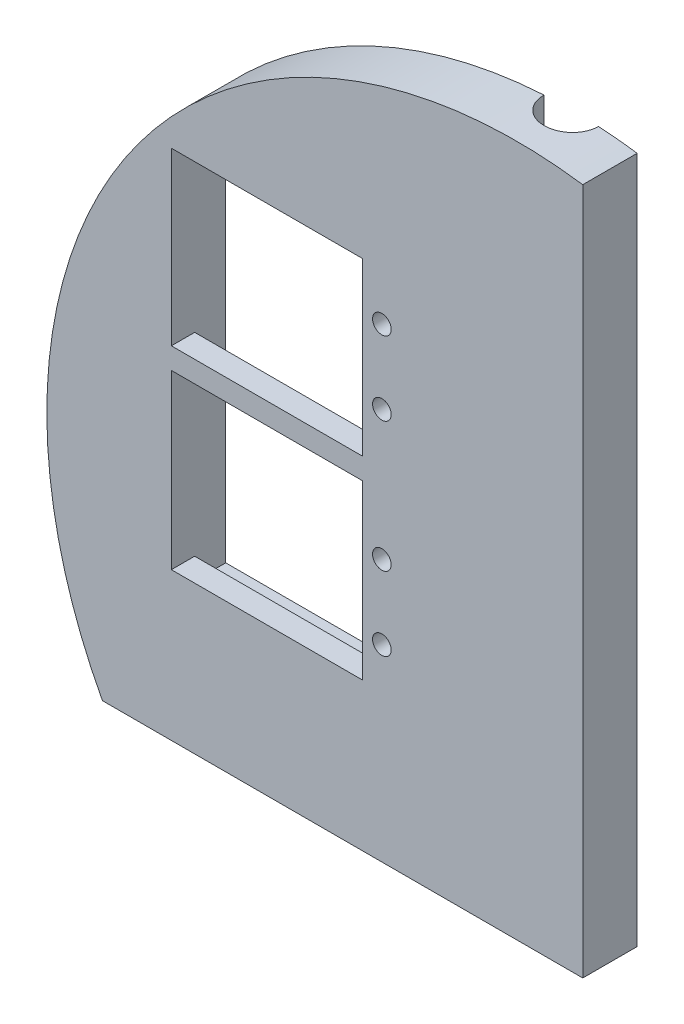
ISO-10303-21;
HEADER;
FILE_DESCRIPTION(('STEP AP214'),'2;1');
FILE_NAME('part.step','',(''),(''),'','','');
FILE_SCHEMA(('AUTOMOTIVE_DESIGN { 1 0 10303 214 1 1 1 1 }'));
ENDSEC;
DATA;
#1=APPLICATION_CONTEXT('core data for automotive mechanical design processes');
#2=APPLICATION_PROTOCOL_DEFINITION('international standard','automotive_design',2000,#1);
#3=PRODUCT_CONTEXT('',#1,'mechanical');
#4=PRODUCT('Part','Part','',(#3));
#5=PRODUCT_RELATED_PRODUCT_CATEGORY('part','',(#4));
#6=PRODUCT_DEFINITION_FORMATION('','',#4);
#7=PRODUCT_DEFINITION_CONTEXT('part definition',#1,'design');
#8=PRODUCT_DEFINITION('design','',#6,#7);
#9=PRODUCT_DEFINITION_SHAPE('','',#8);
#10=(LENGTH_UNIT() NAMED_UNIT(*) SI_UNIT(.MILLI.,.METRE.));
#11=(NAMED_UNIT(*) PLANE_ANGLE_UNIT() SI_UNIT($,.RADIAN.));
#12=(NAMED_UNIT(*) SI_UNIT($,.STERADIAN.) SOLID_ANGLE_UNIT());
#13=UNCERTAINTY_MEASURE_WITH_UNIT(LENGTH_MEASURE(1.E-05),#10,'distance_accuracy_value','');
#14=(GEOMETRIC_REPRESENTATION_CONTEXT(3) GLOBAL_UNCERTAINTY_ASSIGNED_CONTEXT((#13)) GLOBAL_UNIT_ASSIGNED_CONTEXT((#10,
#11,#12)) REPRESENTATION_CONTEXT('',''));
#15=CARTESIAN_POINT('',(0.,0.,0.));
#16=DIRECTION('',(0.,0.,1.));
#17=DIRECTION('',(1.,0.,0.));
#18=AXIS2_PLACEMENT_3D('',#15,#16,#17);
#19=CARTESIAN_POINT('',(0.,0.,0.));
#20=DIRECTION('',(0.,0.,1.));
#21=DIRECTION('',(1.,0.,0.));
#22=AXIS2_PLACEMENT_3D('',#19,#20,#21);
#23=PLANE('',#22);
#24=DIRECTION('',(-1.,0.,0.));
#25=VECTOR('',#24,1.);
#26=CARTESIAN_POINT('',(0.,-16.7383494563795,0.));
#27=LINE('',#26,#25);
#28=CARTESIAN_POINT('',(3.09999999999997,-16.7383494563795,0.));
#29=VERTEX_POINT('',#28);
#30=CARTESIAN_POINT('',(2.50000000000061,-16.7383494563795,0.));
#31=VERTEX_POINT('',#30);
#32=EDGE_CURVE('E333',#29,#31,#27,.T.);
#33=ORIENTED_EDGE('',*,*,#32,.F.);
#34=DIRECTION('',(0.,1.,0.));
#35=VECTOR('',#34,1.);
#36=CARTESIAN_POINT('',(3.09999999999997,-16.7383494563795,0.));
#37=LINE('',#36,#35);
#38=CARTESIAN_POINT('',(3.09999999999997,-14.7383494563795,0.));
#39=VERTEX_POINT('',#38);
#40=EDGE_CURVE('E59',#29,#39,#37,.T.);
#41=ORIENTED_EDGE('',*,*,#40,.T.);
#42=DIRECTION('',(-1.,0.,0.));
#43=VECTOR('',#42,1.);
#44=CARTESIAN_POINT('',(0.,-14.7383494563795,0.));
#45=LINE('',#44,#43);
#46=CARTESIAN_POINT('',(2.50000000000061,-14.7383494563795,0.));
#47=VERTEX_POINT('',#46);
#48=EDGE_CURVE('E329',#39,#47,#45,.T.);
#49=ORIENTED_EDGE('',*,*,#48,.T.);
#50=DIRECTION('',(0.,1.,0.));
#51=VECTOR('',#50,1.);
#52=CARTESIAN_POINT('',(2.50000000000061,-22.5,0.));
#53=LINE('',#52,#51);
#54=CARTESIAN_POINT('',(2.50000000000061,-9.50000000000001,0.));
#55=VERTEX_POINT('',#54);
#56=EDGE_CURVE('E357',#47,#55,#53,.T.);
#57=ORIENTED_EDGE('',*,*,#56,.T.);
#58=DIRECTION('',(-1.,0.,0.));
#59=VECTOR('',#58,1.);
#60=CARTESIAN_POINT('',(0.,-9.50000000000001,0.));
#61=LINE('',#60,#59);
#62=CARTESIAN_POINT('',(3.50000000003442,-9.50000000000001,0.));
#63=VERTEX_POINT('',#62);
#64=EDGE_CURVE('E278',#63,#55,#61,.T.);
#65=ORIENTED_EDGE('',*,*,#64,.F.);
#66=DIRECTION('',(0.,1.,0.));
#67=VECTOR('',#66,1.);
#68=CARTESIAN_POINT('',(3.50000000003442,-9.50000000000001,0.));
#69=LINE('',#68,#67);
#70=CARTESIAN_POINT('',(3.50000000003442,60.398675482164,0.));
#71=VERTEX_POINT('',#70);
#72=EDGE_CURVE('E290',#63,#71,#69,.T.);
#73=ORIENTED_EDGE('',*,*,#72,.T.);
#74=CARTESIAN_POINT('',(0.,0.,0.));
#75=DIRECTION('',(0.,0.,1.));
#76=DIRECTION('',(1.,0.,0.));
#77=AXIS2_PLACEMENT_3D('',#74,#75,#76);
#78=CIRCLE('',#77,60.5);
#79=CARTESIAN_POINT('',(8.48784603441241,59.9016399583193,0.));
#80=VERTEX_POINT('',#79);
#81=EDGE_CURVE('E273',#80,#71,#78,.T.);
#82=ORIENTED_EDGE('',*,*,#81,.F.);
#83=DIRECTION('',(0.,-1.,0.));
#84=VECTOR('',#83,1.);
#85=CARTESIAN_POINT('',(8.48784603441242,0.,0.));
#86=LINE('',#85,#84);
#87=CARTESIAN_POINT('',(8.48784603441242,-28.5421058613369,0.));
#88=VERTEX_POINT('',#87);
#89=EDGE_CURVE('E293',#80,#88,#86,.T.);
#90=ORIENTED_EDGE('',*,*,#89,.T.);
#91=DIRECTION('',(-1.,0.,0.));
#92=VECTOR('',#91,1.);
#93=CARTESIAN_POINT('',(0.,-28.5421058613369,0.));
#94=LINE('',#93,#92);
#95=CARTESIAN_POINT('',(-53.3441486294443,-28.5421058613369,0.));
#96=VERTEX_POINT('',#95);
#97=EDGE_CURVE('E295',#88,#96,#94,.T.);
#98=ORIENTED_EDGE('',*,*,#97,.T.);
#99=CARTESIAN_POINT('',(-3.49999999996558,60.398675482168,0.));
#100=VERTEX_POINT('',#99);
#101=EDGE_CURVE('E279',#100,#96,#78,.T.);
#102=ORIENTED_EDGE('',*,*,#101,.F.);
#103=DIRECTION('',(0.,1.,0.));
#104=VECTOR('',#103,1.);
#105=CARTESIAN_POINT('',(-3.49999999996558,-9.50000000000001,0.));
#106=LINE('',#105,#104);
#107=CARTESIAN_POINT('',(-3.49999999996558,37.4902757720887,0.));
#108=VERTEX_POINT('',#107);
#109=EDGE_CURVE('E283',#100,#108,#106,.F.);
#110=ORIENTED_EDGE('',*,*,#109,.T.);
#111=DIRECTION('',(1.,0.,0.));
#112=VECTOR('',#111,1.);
#113=CARTESIAN_POINT('',(-2.,37.4902757720887,0.));
#114=LINE('',#113,#112);
#115=CARTESIAN_POINT('',(-44.4723778560623,37.4902757720887,0.));
#116=VERTEX_POINT('',#115);
#117=EDGE_CURVE('E442',#116,#108,#114,.T.);
#118=ORIENTED_EDGE('',*,*,#117,.F.);
#119=DIRECTION('',(0.,1.,0.));
#120=VECTOR('',#119,1.);
#121=CARTESIAN_POINT('',(-44.4723778560623,37.4902757720887,0.));
#122=LINE('',#121,#120);
#123=CARTESIAN_POINT('',(-44.4723778560623,-12.2383494563795,0.));
#124=VERTEX_POINT('',#123);
#125=EDGE_CURVE('E435',#124,#116,#122,.T.);
#126=ORIENTED_EDGE('',*,*,#125,.F.);
#127=DIRECTION('',(-1.,0.,0.));
#128=VECTOR('',#127,1.);
#129=CARTESIAN_POINT('',(-44.4723778560623,-12.2383494563795,0.));
#130=LINE('',#129,#128);
#131=CARTESIAN_POINT('',(-2.50000000000045,-12.2383494563795,0.));
#132=VERTEX_POINT('',#131);
#133=EDGE_CURVE('E441',#132,#124,#130,.T.);
#134=ORIENTED_EDGE('',*,*,#133,.F.);
#135=DIRECTION('',(0.,1.,0.));
#136=VECTOR('',#135,1.);
#137=CARTESIAN_POINT('',(-2.50000000000045,-22.5,0.));
#138=LINE('',#137,#136);
#139=CARTESIAN_POINT('',(-2.50000000000045,-14.7383494563795,0.));
#140=VERTEX_POINT('',#139);
#141=EDGE_CURVE('E225',#132,#140,#138,.F.);
#142=ORIENTED_EDGE('',*,*,#141,.T.);
#143=CARTESIAN_POINT('',(-3.10000000000014,-14.7383494563795,0.));
#144=VERTEX_POINT('',#143);
#145=EDGE_CURVE('E75',#140,#144,#45,.T.);
#146=ORIENTED_EDGE('',*,*,#145,.T.);
#147=DIRECTION('',(0.,1.,0.));
#148=VECTOR('',#147,1.);
#149=CARTESIAN_POINT('',(-3.10000000000014,-16.7383494563795,0.));
#150=LINE('',#149,#148);
#151=CARTESIAN_POINT('',(-3.10000000000014,-16.7383494563795,0.));
#152=VERTEX_POINT('',#151);
#153=EDGE_CURVE('E321',#144,#152,#150,.F.);
#154=ORIENTED_EDGE('',*,*,#153,.T.);
#155=CARTESIAN_POINT('',(-2.50000000000045,-16.7383494563795,0.));
#156=VERTEX_POINT('',#155);
#157=EDGE_CURVE('E343',#156,#152,#27,.T.);
#158=ORIENTED_EDGE('',*,*,#157,.F.);
#159=CARTESIAN_POINT('',(-2.50000000000045,-22.5,0.));
#160=VERTEX_POINT('',#159);
#161=EDGE_CURVE('E355',#156,#160,#138,.F.);
#162=ORIENTED_EDGE('',*,*,#161,.T.);
#163=DIRECTION('',(-1.,0.,0.));
#164=VECTOR('',#163,1.);
#165=CARTESIAN_POINT('',(0.,-22.5,0.));
#166=LINE('',#165,#164);
#167=CARTESIAN_POINT('',(2.50000000000061,-22.5,0.));
#168=VERTEX_POINT('',#167);
#169=EDGE_CURVE('E221',#168,#160,#166,.T.);
#170=ORIENTED_EDGE('',*,*,#169,.F.);
#171=EDGE_CURVE('E360',#168,#31,#53,.T.);
#172=ORIENTED_EDGE('',*,*,#171,.T.);
#173=EDGE_LOOP('',(#33,#41,#49,#57,#65,#73,#82,#90,#98,#102,#110,#118,#126,#134,#142,#146,#154,
#158,#162,#170,#172));
#174=FACE_BOUND('',#173,.T.);
#175=ADVANCED_FACE('F47',(#174),#23,.F.);
#176=CARTESIAN_POINT('',(0.,-22.5,0.));
#177=DIRECTION('',(0.,1.,0.));
#178=DIRECTION('',(0.,0.,1.));
#179=AXIS2_PLACEMENT_3D('',#176,#177,#178);
#180=CYLINDRICAL_SURFACE('',#179,2.50000000000053);
#181=CARTESIAN_POINT('',(0.,-16.7383494563795,0.));
#182=DIRECTION('',(0.,1.,0.));
#183=DIRECTION('',(0.,0.,1.));
#184=AXIS2_PLACEMENT_3D('',#181,#182,#183);
#185=CIRCLE('',#184,2.50000000000053);
#186=EDGE_CURVE('E323',#31,#156,#185,.F.);
#187=ORIENTED_EDGE('',*,*,#186,.F.);
#188=ORIENTED_EDGE('',*,*,#171,.F.);
#189=CARTESIAN_POINT('',(0.,-22.5,0.));
#190=DIRECTION('',(0.,1.,0.));
#191=DIRECTION('',(0.,0.,1.));
#192=AXIS2_PLACEMENT_3D('',#189,#190,#191);
#193=CIRCLE('',#192,2.50000000000053);
#194=EDGE_CURVE('E347',#160,#168,#193,.T.);
#195=ORIENTED_EDGE('',*,*,#194,.F.);
#196=ORIENTED_EDGE('',*,*,#161,.F.);
#197=EDGE_LOOP('',(#187,#188,#195,#196));
#198=FACE_BOUND('',#197,.T.);
#199=ADVANCED_FACE('F242',(#198),#180,.F.);
#200=CARTESIAN_POINT('',(0.,0.,4.));
#201=DIRECTION('',(0.,0.,1.));
#202=DIRECTION('',(1.,0.,0.));
#203=AXIS2_PLACEMENT_3D('',#200,#201,#202);
#204=PLANE('',#203);
#205=CARTESIAN_POINT('',(-17.373644116037,-4.3075310000471,4.));
#206=DIRECTION('',(0.,0.,-1.));
#207=DIRECTION('',(-1.,0.,0.));
#208=AXIS2_PLACEMENT_3D('',#205,#206,#207);
#209=CIRCLE('',#208,2.2);
#210=CARTESIAN_POINT('',(-19.573644116037,-4.3075310000471,4.));
#211=VERTEX_POINT('',#210);
#212=EDGE_CURVE('E387',#211,#211,#209,.T.);
#213=ORIENTED_EDGE('',*,*,#212,.F.);
#214=EDGE_LOOP('',(#213));
#215=FACE_BOUND('',#214,.T.);
#216=CARTESIAN_POINT('',(-17.3776969994148,5.19246813543373,4.));
#217=DIRECTION('',(0.,0.,-1.));
#218=DIRECTION('',(-1.,0.,0.));
#219=AXIS2_PLACEMENT_3D('',#216,#217,#218);
#220=CIRCLE('',#219,2.2);
#221=CARTESIAN_POINT('',(-19.5776969994148,5.19246813543373,4.));
#222=VERTEX_POINT('',#221);
#223=EDGE_CURVE('E397',#222,#222,#220,.T.);
#224=ORIENTED_EDGE('',*,*,#223,.F.);
#225=EDGE_LOOP('',(#224));
#226=FACE_BOUND('',#225,.T.);
#227=CARTESIAN_POINT('',(-17.371512218157,21.9269050735277,4.));
#228=DIRECTION('',(0.,0.,-1.));
#229=DIRECTION('',(-1.,0.,0.));
#230=AXIS2_PLACEMENT_3D('',#227,#228,#229);
#231=CIRCLE('',#230,2.2);
#232=CARTESIAN_POINT('',(-19.571512218157,21.9269050735277,4.));
#233=VERTEX_POINT('',#232);
#234=EDGE_CURVE('E406',#233,#233,#231,.T.);
#235=ORIENTED_EDGE('',*,*,#234,.F.);
#236=EDGE_LOOP('',(#235));
#237=FACE_BOUND('',#236,.T.);
#238=CARTESIAN_POINT('',(-17.371512218157,31.4269050735276,4.));
#239=DIRECTION('',(0.,0.,-1.));
#240=DIRECTION('',(-1.,0.,0.));
#241=AXIS2_PLACEMENT_3D('',#238,#239,#240);
#242=CIRCLE('',#241,2.2);
#243=CARTESIAN_POINT('',(-19.571512218157,31.4269050735276,4.));
#244=VERTEX_POINT('',#243);
#245=EDGE_CURVE('E420',#244,#244,#242,.T.);
#246=ORIENTED_EDGE('',*,*,#245,.F.);
#247=EDGE_LOOP('',(#246));
#248=FACE_BOUND('',#247,.T.);
#249=DIRECTION('',(0.,-1.,0.));
#250=VECTOR('',#249,1.);
#251=CARTESIAN_POINT('',(-19.8820759993379,15.4563544375841,4.));
#252=LINE('',#251,#250);
#253=CARTESIAN_POINT('',(-19.8820759993379,37.4902757720887,4.));
#254=VERTEX_POINT('',#253);
#255=CARTESIAN_POINT('',(-19.8820759993379,15.4563544375841,4.));
#256=VERTEX_POINT('',#255);
#257=EDGE_CURVE('E358',#254,#256,#252,.T.);
#258=ORIENTED_EDGE('',*,*,#257,.F.);
#259=DIRECTION('',(1.,0.,0.));
#260=VECTOR('',#259,1.);
#261=CARTESIAN_POINT('',(-2.,37.4902757720887,4.));
#262=LINE('',#261,#260);
#263=CARTESIAN_POINT('',(-1.,37.4902757720887,4.));
#264=VERTEX_POINT('',#263);
#265=EDGE_CURVE('E439',#254,#264,#262,.T.);
#266=ORIENTED_EDGE('',*,*,#265,.T.);
#267=DIRECTION('',(0.,1.,0.));
#268=VECTOR('',#267,1.);
#269=CARTESIAN_POINT('',(-1.,37.4902757720887,4.));
#270=LINE('',#269,#268);
#271=CARTESIAN_POINT('',(-1.,-12.2383494563795,4.));
#272=VERTEX_POINT('',#271);
#273=EDGE_CURVE('E212',#272,#264,#270,.T.);
#274=ORIENTED_EDGE('',*,*,#273,.F.);
#275=DIRECTION('',(-1.,0.,0.));
#276=VECTOR('',#275,1.);
#277=CARTESIAN_POINT('',(-44.4723778560623,-12.2383494563795,4.));
#278=LINE('',#277,#276);
#279=CARTESIAN_POINT('',(-44.4723778560623,-12.2383494563795,4.));
#280=VERTEX_POINT('',#279);
#281=EDGE_CURVE('E211',#272,#280,#278,.T.);
#282=ORIENTED_EDGE('',*,*,#281,.T.);
#283=DIRECTION('',(0.,1.,0.));
#284=VECTOR('',#283,1.);
#285=CARTESIAN_POINT('',(-44.4723778560623,37.4902757720887,4.));
#286=LINE('',#285,#284);
#287=CARTESIAN_POINT('',(-44.4723778560623,-9.500807520189,4.));
#288=VERTEX_POINT('',#287);
#289=EDGE_CURVE('E434',#280,#288,#286,.T.);
#290=ORIENTED_EDGE('',*,*,#289,.T.);
#291=DIRECTION('',(-1.,0.,0.));
#292=VECTOR('',#291,1.);
#293=CARTESIAN_POINT('',(-44.4723778560623,-9.500807520189,4.));
#294=LINE('',#293,#292);
#295=CARTESIAN_POINT('',(-19.8715107920174,-9.500807520189,4.));
#296=VERTEX_POINT('',#295);
#297=EDGE_CURVE('E384',#296,#288,#294,.T.);
#298=ORIENTED_EDGE('',*,*,#297,.F.);
#299=DIRECTION('',(0.000475599259911524,-0.999999886902666,0.));
#300=VECTOR('',#299,1.);
#301=CARTESIAN_POINT('',(-19.8715107920174,-9.500807520189,4.));
#302=LINE('',#301,#300);
#303=CARTESIAN_POINT('',(-19.8820759993379,12.7137058656536,4.));
#304=VERTEX_POINT('',#303);
#305=EDGE_CURVE('E365',#304,#296,#302,.T.);
#306=ORIENTED_EDGE('',*,*,#305,.F.);
#307=DIRECTION('',(1.,0.,0.));
#308=VECTOR('',#307,1.);
#309=CARTESIAN_POINT('',(-19.8820759993379,12.7137058656536,4.));
#310=LINE('',#309,#308);
#311=CARTESIAN_POINT('',(-44.4723778560623,12.7137058656536,4.));
#312=VERTEX_POINT('',#311);
#313=EDGE_CURVE('E376',#312,#304,#310,.T.);
#314=ORIENTED_EDGE('',*,*,#313,.F.);
#315=CARTESIAN_POINT('',(-44.4723778560623,15.4563544375841,4.));
#316=VERTEX_POINT('',#315);
#317=EDGE_CURVE('E436',#312,#316,#286,.T.);
#318=ORIENTED_EDGE('',*,*,#317,.T.);
#319=DIRECTION('',(-1.,0.,0.));
#320=VECTOR('',#319,1.);
#321=CARTESIAN_POINT('',(-44.4723778560623,15.4563544375841,4.));
#322=LINE('',#321,#320);
#323=EDGE_CURVE('E361',#256,#316,#322,.T.);
#324=ORIENTED_EDGE('',*,*,#323,.F.);
#325=EDGE_LOOP('',(#258,#266,#274,#282,#290,#298,#306,#314,#318,#324));
#326=FACE_BOUND('',#325,.T.);
#327=ADVANCED_FACE('F247',(#215,#226,#237,#248,#326),#204,.F.);
#328=CARTESIAN_POINT('',(0.,0.,7.));
#329=DIRECTION('',(0.,0.,-1.));
#330=DIRECTION('',(-1.,0.,0.));
#331=AXIS2_PLACEMENT_3D('',#328,#329,#330);
#332=CYLINDRICAL_SURFACE('',#331,60.5);
#333=ORIENTED_EDGE('',*,*,#101,.T.);
#334=DIRECTION('',(0.,0.,1.));
#335=VECTOR('',#334,1.);
#336=CARTESIAN_POINT('',(-53.3441486294443,-28.5421058613369,-3.));
#337=LINE('',#336,#335);
#338=CARTESIAN_POINT('',(-53.3441486294443,-28.5421058613369,7.));
#339=VERTEX_POINT('',#338);
#340=EDGE_CURVE('E460',#96,#339,#337,.T.);
#341=ORIENTED_EDGE('',*,*,#340,.T.);
#342=CARTESIAN_POINT('',(0.,0.,7.));
#343=DIRECTION('',(0.,0.,1.));
#344=DIRECTION('',(1.,0.,0.));
#345=AXIS2_PLACEMENT_3D('',#342,#343,#344);
#346=CIRCLE('',#345,60.5);
#347=CARTESIAN_POINT('',(8.48784603441241,59.9016399583193,7.));
#348=VERTEX_POINT('',#347);
#349=EDGE_CURVE('E276',#348,#339,#346,.T.);
#350=ORIENTED_EDGE('',*,*,#349,.F.);
#351=DIRECTION('',(0.,0.,1.));
#352=VECTOR('',#351,1.);
#353=CARTESIAN_POINT('',(8.48784603441241,59.9016399583193,-3.));
#354=LINE('',#353,#352);
#355=EDGE_CURVE('E457',#80,#348,#354,.T.);
#356=ORIENTED_EDGE('',*,*,#355,.F.);
#357=ORIENTED_EDGE('',*,*,#81,.T.);
#358=CARTESIAN_POINT('',(3.50000000003442,60.398675482164,0.));
#359=CARTESIAN_POINT('',(3.50000952693264,60.398673138297,0.0983527657712839));
#360=CARTESIAN_POINT('',(3.49585435544842,60.3989156684955,0.196700946772377));
#361=CARTESIAN_POINT('',(3.47928835721452,60.3998731671281,0.392692080631501));
#362=CARTESIAN_POINT('',(3.46687797670895,60.4005881100253,0.490335071320959));
#363=CARTESIAN_POINT('',(3.43388790216585,60.4024724071079,0.684156432208212));
#364=CARTESIAN_POINT('',(3.41331446072073,60.4036414134836,0.780335865023678));
#365=CARTESIAN_POINT('',(3.36416643400679,60.4063985365345,0.970593237529522));
#366=CARTESIAN_POINT('',(3.33559193558346,60.4079866486607,1.06467120001783));
#367=CARTESIAN_POINT('',(3.23810185102494,60.4133180889932,1.34284085923981));
#368=CARTESIAN_POINT('',(3.1574052385381,60.4176293982524,1.52295268028292));
#369=CARTESIAN_POINT('',(2.96702667085545,60.4272767162173,1.86693430382375));
#370=CARTESIAN_POINT('',(2.85735094592784,60.4326125046013,2.03080758707166));
#371=CARTESIAN_POINT('',(2.61196050746828,60.4437153357395,2.33801745158537));
#372=CARTESIAN_POINT('',(2.47622057303447,60.4494827928702,2.48133390454184));
#373=CARTESIAN_POINT('',(2.18255455108583,60.4607972262713,2.74320572601958));
#374=CARTESIAN_POINT('',(2.02462004625511,60.4663441178633,2.86175165767552));
#375=CARTESIAN_POINT('',(1.69090577353212,60.4765964279645,3.07077461339094));
#376=CARTESIAN_POINT('',(1.51510667155134,60.4813009192443,3.16122078755021));
#377=CARTESIAN_POINT('',(1.15092283784931,60.4893248003223,3.31120432193968));
#378=CARTESIAN_POINT('',(0.962553025279566,60.492645799313,3.3707776113962));
#379=CARTESIAN_POINT('',(0.644288181579025,60.4967019541037,3.44263116568296));
#380=CARTESIAN_POINT('',(0.516401641595087,60.4979329159732,3.46411532160443));
#381=CARTESIAN_POINT('',(0.25902882531931,60.4995823791425,3.49280264476635));
#382=CARTESIAN_POINT('',(0.129542517910183,60.5000008646136,3.50000553377854));
#383=CARTESIAN_POINT('',(-0.196434361794498,60.499998688926,3.49999160871993));
#384=CARTESIAN_POINT('',(-0.392997972742864,60.4990331337587,3.48340833321626));
#385=CARTESIAN_POINT('',(-0.780686296161684,60.4952744408766,3.41749489503516));
#386=CARTESIAN_POINT('',(-0.971804905162376,60.4924793304404,3.36812938401568));
#387=CARTESIAN_POINT('',(-1.34294965048072,60.4853777813022,3.23807310842924));
#388=CARTESIAN_POINT('',(-1.52298119779414,60.4810720868172,3.15739776715231));
#389=CARTESIAN_POINT('',(-1.86690578488376,60.4714337418408,2.9670341447194));
#390=CARTESIAN_POINT('',(-2.03080200623368,60.4661012944206,2.85735159900897));
#391=CARTESIAN_POINT('',(-2.3380516509251,60.4550015695797,2.61193699903912));
#392=CARTESIAN_POINT('',(-2.48138205153041,60.4492338156978,2.47617614238439));
#393=CARTESIAN_POINT('',(-2.74324146471149,60.4379173176108,2.18250490616198));
#394=CARTESIAN_POINT('',(-2.86176851670297,60.4323685907469,2.02459277729046));
#395=CARTESIAN_POINT('',(-3.07074255460529,60.4221113116321,1.69095730965756));
#396=CARTESIAN_POINT('',(-3.16116341180633,60.41740354289,1.51521759768625));
#397=CARTESIAN_POINT('',(-3.31116694122077,60.4093689032918,1.15104192639792));
#398=CARTESIAN_POINT('',(-3.37076580943649,60.4060413073798,0.962612693986242));
#399=CARTESIAN_POINT('',(-3.44265166587481,60.4019781480782,0.64419250817945));
#400=CARTESIAN_POINT('',(-3.4641441997656,60.4007455211632,0.51621028974263));
#401=CARTESIAN_POINT('',(-3.4928164942286,60.3990918062692,0.258836723195604));
#402=CARTESIAN_POINT('',(-3.50001706709792,60.3986695382559,0.12944770040098));
#403=CARTESIAN_POINT('',(-3.49999999996558,60.398675482168,0.));
#404=B_SPLINE_CURVE_WITH_KNOTS('',3,(#358,#359,#360,#361,#362,#363,#364,#365,#366,#367,#368,
#369,#370,#371,#372,#373,#374,#375,#376,#377,#378,#379,#380,#381,#382,#383,#384,#385,#386,#387,
#388,#389,#390,#391,#392,#393,#394,#395,#396,#397,#398,#399,#400,#401,#402,#403),.UNSPECIFIED.,
.F.,.F.,(4,2,2,2,2,2,2,2,2,2,2,2,2,2,2,2,2,2,2,2,2,2,4),(0.,0.29496201421359,0.589908085236844,
0.884628673632343,1.17934606317985,1.76852732561746,2.35758202190403,2.9472096129301,
3.53706142741172,4.12755855300559,4.71736691819767,5.10567576950155,5.49399218578099,
6.0828234717304,6.67229071430916,7.26146795186213,7.85052878140971,8.4402439839181,
9.030005782957,9.62031422105357,10.2103121543329,10.5989067229187,10.9869349943643),.UNSPECIFIED.);
#405=EDGE_CURVE('E266',#71,#100,#404,.T.);
#406=ORIENTED_EDGE('',*,*,#405,.T.);
#407=EDGE_LOOP('',(#333,#341,#350,#356,#357,#406));
#408=FACE_BOUND('',#407,.T.);
#409=ADVANCED_FACE('F51',(#408),#332,.T.);
#410=CARTESIAN_POINT('',(0.,0.,7.));
#411=DIRECTION('',(0.,0.,1.));
#412=DIRECTION('',(1.,0.,0.));
#413=AXIS2_PLACEMENT_3D('',#410,#411,#412);
#414=PLANE('',#413);
#415=DIRECTION('',(0.,-1.,0.));
#416=VECTOR('',#415,1.);
#417=CARTESIAN_POINT('',(-44.4723778560623,0.,7.));
#418=LINE('',#417,#416);
#419=CARTESIAN_POINT('',(-44.4723778560623,37.4902757720887,7.));
#420=VERTEX_POINT('',#419);
#421=CARTESIAN_POINT('',(-44.4723778560623,15.4563544375841,7.));
#422=VERTEX_POINT('',#421);
#423=EDGE_CURVE('E222',#420,#422,#418,.T.);
#424=ORIENTED_EDGE('',*,*,#423,.F.);
#425=DIRECTION('',(-1.,0.,0.));
#426=VECTOR('',#425,1.);
#427=CARTESIAN_POINT('',(0.,37.4902757720887,7.));
#428=LINE('',#427,#426);
#429=CARTESIAN_POINT('',(-19.8820759993379,37.4902757720887,7.));
#430=VERTEX_POINT('',#429);
#431=EDGE_CURVE('E306',#430,#420,#428,.T.);
#432=ORIENTED_EDGE('',*,*,#431,.F.);
#433=DIRECTION('',(0.,1.,0.));
#434=VECTOR('',#433,1.);
#435=CARTESIAN_POINT('',(-19.8820759993379,0.,7.));
#436=LINE('',#435,#434);
#437=CARTESIAN_POINT('',(-19.8820759993379,15.4563544375841,7.));
#438=VERTEX_POINT('',#437);
#439=EDGE_CURVE('E314',#438,#430,#436,.T.);
#440=ORIENTED_EDGE('',*,*,#439,.F.);
#441=DIRECTION('',(1.,0.,0.));
#442=VECTOR('',#441,1.);
#443=CARTESIAN_POINT('',(0.,15.4563544375841,7.));
#444=LINE('',#443,#442);
#445=EDGE_CURVE('E313',#422,#438,#444,.T.);
#446=ORIENTED_EDGE('',*,*,#445,.F.);
#447=EDGE_LOOP('',(#424,#432,#440,#446));
#448=FACE_BOUND('',#447,.T.);
#449=DIRECTION('',(-0.000475599259911524,0.999999886902666,0.));
#450=VECTOR('',#449,1.);
#451=CARTESIAN_POINT('',(-19.876024873702,-0.0094530237890275,7.));
#452=LINE('',#451,#450);
#453=CARTESIAN_POINT('',(-19.8715107920174,-9.500807520189,7.));
#454=VERTEX_POINT('',#453);
#455=CARTESIAN_POINT('',(-19.8820759993379,12.7137058656536,7.));
#456=VERTEX_POINT('',#455);
#457=EDGE_CURVE('E370',#454,#456,#452,.T.);
#458=ORIENTED_EDGE('',*,*,#457,.F.);
#459=DIRECTION('',(1.,0.,0.));
#460=VECTOR('',#459,1.);
#461=CARTESIAN_POINT('',(0.,-9.500807520189,7.));
#462=LINE('',#461,#460);
#463=CARTESIAN_POINT('',(-44.4723778560623,-9.500807520189,7.));
#464=VERTEX_POINT('',#463);
#465=EDGE_CURVE('E301',#464,#454,#462,.T.);
#466=ORIENTED_EDGE('',*,*,#465,.F.);
#467=DIRECTION('',(0.,-1.,0.));
#468=VECTOR('',#467,1.);
#469=CARTESIAN_POINT('',(-44.4723778560623,0.,7.));
#470=LINE('',#469,#468);
#471=CARTESIAN_POINT('',(-44.4723778560623,12.7137058656536,7.));
#472=VERTEX_POINT('',#471);
#473=EDGE_CURVE('E304',#472,#464,#470,.T.);
#474=ORIENTED_EDGE('',*,*,#473,.F.);
#475=DIRECTION('',(-1.,0.,0.));
#476=VECTOR('',#475,1.);
#477=CARTESIAN_POINT('',(0.,12.7137058656536,7.));
#478=LINE('',#477,#476);
#479=EDGE_CURVE('E307',#456,#472,#478,.T.);
#480=ORIENTED_EDGE('',*,*,#479,.F.);
#481=EDGE_LOOP('',(#458,#466,#474,#480));
#482=FACE_BOUND('',#481,.T.);
#483=CARTESIAN_POINT('',(-17.373644116037,-4.3075310000471,7.));
#484=DIRECTION('',(0.,0.,-1.));
#485=DIRECTION('',(-1.,0.,0.));
#486=AXIS2_PLACEMENT_3D('',#483,#484,#485);
#487=CIRCLE('',#486,1.2);
#488=CARTESIAN_POINT('',(-18.573644116037,-4.3075310000471,7.));
#489=VERTEX_POINT('',#488);
#490=EDGE_CURVE('E398',#489,#489,#487,.T.);
#491=ORIENTED_EDGE('',*,*,#490,.T.);
#492=EDGE_LOOP('',(#491));
#493=FACE_BOUND('',#492,.T.);
#494=CARTESIAN_POINT('',(-17.3776969994148,5.19246813543373,7.));
#495=DIRECTION('',(0.,0.,-1.));
#496=DIRECTION('',(-1.,0.,0.));
#497=AXIS2_PLACEMENT_3D('',#494,#495,#496);
#498=CIRCLE('',#497,1.2);
#499=CARTESIAN_POINT('',(-18.5776969994148,5.19246813543373,7.));
#500=VERTEX_POINT('',#499);
#501=EDGE_CURVE('E405',#500,#500,#498,.T.);
#502=ORIENTED_EDGE('',*,*,#501,.T.);
#503=EDGE_LOOP('',(#502));
#504=FACE_BOUND('',#503,.T.);
#505=CARTESIAN_POINT('',(-17.371512218157,21.9269050735277,7.));
#506=DIRECTION('',(0.,0.,-1.));
#507=DIRECTION('',(-1.,0.,0.));
#508=AXIS2_PLACEMENT_3D('',#505,#506,#507);
#509=CIRCLE('',#508,1.2);
#510=CARTESIAN_POINT('',(-18.571512218157,21.9269050735277,7.));
#511=VERTEX_POINT('',#510);
#512=EDGE_CURVE('E414',#511,#511,#509,.T.);
#513=ORIENTED_EDGE('',*,*,#512,.T.);
#514=EDGE_LOOP('',(#513));
#515=FACE_BOUND('',#514,.T.);
#516=CARTESIAN_POINT('',(-17.371512218157,31.4269050735276,7.));
#517=DIRECTION('',(0.,0.,-1.));
#518=DIRECTION('',(-1.,0.,0.));
#519=AXIS2_PLACEMENT_3D('',#516,#517,#518);
#520=CIRCLE('',#519,1.2);
#521=CARTESIAN_POINT('',(-18.571512218157,31.4269050735276,7.));
#522=VERTEX_POINT('',#521);
#523=EDGE_CURVE('E218',#522,#522,#520,.T.);
#524=ORIENTED_EDGE('',*,*,#523,.T.);
#525=EDGE_LOOP('',(#524));
#526=FACE_BOUND('',#525,.T.);
#527=DIRECTION('',(0.,-1.,0.));
#528=VECTOR('',#527,1.);
#529=CARTESIAN_POINT('',(8.48784603441241,59.9016399583193,7.));
#530=LINE('',#529,#528);
#531=CARTESIAN_POINT('',(8.48784603441242,-28.5421058613369,7.));
#532=VERTEX_POINT('',#531);
#533=EDGE_CURVE('E449',#348,#532,#530,.T.);
#534=ORIENTED_EDGE('',*,*,#533,.F.);
#535=ORIENTED_EDGE('',*,*,#349,.T.);
#536=DIRECTION('',(-1.,0.,0.));
#537=VECTOR('',#536,1.);
#538=CARTESIAN_POINT('',(8.48784603441242,-28.5421058613369,7.));
#539=LINE('',#538,#537);
#540=EDGE_CURVE('E453',#532,#339,#539,.T.);
#541=ORIENTED_EDGE('',*,*,#540,.F.);
#542=EDGE_LOOP('',(#534,#535,#541));
#543=FACE_BOUND('',#542,.T.);
#544=ADVANCED_FACE('F253',(#448,#482,#493,#504,#515,#526,#543),#414,.T.);
#545=CARTESIAN_POINT('',(3.44169137633799E-11,-9.50000000000001,-1.01030295240889E-11));
#546=DIRECTION('',(0.,1.,0.));
#547=DIRECTION('',(0.,0.,1.));
#548=AXIS2_PLACEMENT_3D('',#545,#546,#547);
#549=CYLINDRICAL_SURFACE('',#548,3.5);
#550=DIRECTION('',(0.,1.,0.));
#551=VECTOR('',#550,1.);
#552=CARTESIAN_POINT('',(-1.,-9.50000000000001,3.35410196622932));
#553=LINE('',#552,#551);
#554=CARTESIAN_POINT('',(-1.,-9.50000000000001,3.35410196622932));
#555=VERTEX_POINT('',#554);
#556=CARTESIAN_POINT('',(-1.,37.4902757720887,3.35410196622932));
#557=VERTEX_POINT('',#556);
#558=EDGE_CURVE('E428',#555,#557,#553,.T.);
#559=ORIENTED_EDGE('',*,*,#558,.T.);
#560=CARTESIAN_POINT('',(3.44169137633799E-11,37.4902757720887,-1.01030295240889E-11));
#561=DIRECTION('',(0.,1.,0.));
#562=DIRECTION('',(0.,0.,1.));
#563=AXIS2_PLACEMENT_3D('',#560,#561,#562);
#564=CIRCLE('',#563,3.5);
#565=EDGE_CURVE('E300',#557,#108,#564,.F.);
#566=ORIENTED_EDGE('',*,*,#565,.T.);
#567=ORIENTED_EDGE('',*,*,#109,.F.);
#568=ORIENTED_EDGE('',*,*,#405,.F.);
#569=ORIENTED_EDGE('',*,*,#72,.F.);
#570=CARTESIAN_POINT('',(3.44169137633799E-11,-9.50000000000001,-1.01030295240889E-11));
#571=DIRECTION('',(0.,1.,0.));
#572=DIRECTION('',(0.,0.,1.));
#573=AXIS2_PLACEMENT_3D('',#570,#571,#572);
#574=CIRCLE('',#573,3.5);
#575=EDGE_CURVE('E272',#555,#63,#574,.T.);
#576=ORIENTED_EDGE('',*,*,#575,.F.);
#577=EDGE_LOOP('',(#559,#566,#567,#568,#569,#576));
#578=FACE_BOUND('',#577,.T.);
#579=ADVANCED_FACE('F257',(#578),#549,.F.);
#580=CARTESIAN_POINT('',(3.44169137633799E-11,-9.50000000000001,-1.01030295240889E-11));
#581=DIRECTION('',(0.,1.,0.));
#582=DIRECTION('',(0.,0.,1.));
#583=AXIS2_PLACEMENT_3D('',#580,#581,#582);
#584=PLANE('',#583);
#585=CARTESIAN_POINT('',(0.,-9.50000000000001,0.));
#586=DIRECTION('',(0.,1.,0.));
#587=DIRECTION('',(0.,0.,1.));
#588=AXIS2_PLACEMENT_3D('',#585,#586,#587);
#589=CIRCLE('',#588,2.50000000000053);
#590=CARTESIAN_POINT('',(-1.,-9.50000000000001,2.29128784747847));
#591=VERTEX_POINT('',#590);
#592=EDGE_CURVE('E352',#591,#55,#589,.T.);
#593=ORIENTED_EDGE('',*,*,#592,.F.);
#594=DIRECTION('',(0.,0.,-1.));
#595=VECTOR('',#594,1.);
#596=CARTESIAN_POINT('',(-1.,-9.50000000000001,-1.01030295240889E-11));
#597=LINE('',#596,#595);
#598=EDGE_CURVE('E63',#555,#591,#597,.T.);
#599=ORIENTED_EDGE('',*,*,#598,.F.);
#600=ORIENTED_EDGE('',*,*,#575,.T.);
#601=ORIENTED_EDGE('',*,*,#64,.T.);
#602=EDGE_LOOP('',(#593,#599,#600,#601));
#603=FACE_BOUND('',#602,.T.);
#604=ADVANCED_FACE('F265',(#603),#584,.T.);
#605=CARTESIAN_POINT('',(8.48784603441242,-28.5421058613369,-3.));
#606=DIRECTION('',(0.,1.,0.));
#607=DIRECTION('',(-1.,0.,0.));
#608=AXIS2_PLACEMENT_3D('',#605,#606,#607);
#609=PLANE('',#608);
#610=DIRECTION('',(0.,0.,1.));
#611=VECTOR('',#610,1.);
#612=CARTESIAN_POINT('',(8.48784603441242,-28.5421058613369,-3.));
#613=LINE('',#612,#611);
#614=EDGE_CURVE('E458',#88,#532,#613,.T.);
#615=ORIENTED_EDGE('',*,*,#614,.T.);
#616=ORIENTED_EDGE('',*,*,#540,.T.);
#617=ORIENTED_EDGE('',*,*,#340,.F.);
#618=ORIENTED_EDGE('',*,*,#97,.F.);
#619=EDGE_LOOP('',(#615,#616,#617,#618));
#620=FACE_BOUND('',#619,.T.);
#621=ADVANCED_FACE('F471',(#620),#609,.F.);
#622=CARTESIAN_POINT('',(8.48784603441241,59.9016399583193,-3.));
#623=DIRECTION('',(-1.,0.,0.));
#624=DIRECTION('',(0.,-1.,0.));
#625=AXIS2_PLACEMENT_3D('',#622,#623,#624);
#626=PLANE('',#625);
#627=ORIENTED_EDGE('',*,*,#355,.T.);
#628=ORIENTED_EDGE('',*,*,#533,.T.);
#629=ORIENTED_EDGE('',*,*,#614,.F.);
#630=ORIENTED_EDGE('',*,*,#89,.F.);
#631=EDGE_LOOP('',(#627,#628,#629,#630));
#632=FACE_BOUND('',#631,.T.);
#633=ADVANCED_FACE('F463',(#632),#626,.F.);
#634=CARTESIAN_POINT('',(-2.,37.4902757720887,4.));
#635=DIRECTION('',(0.,1.,0.));
#636=DIRECTION('',(0.,0.,1.));
#637=AXIS2_PLACEMENT_3D('',#634,#635,#636);
#638=PLANE('',#637);
#639=ORIENTED_EDGE('',*,*,#565,.F.);
#640=DIRECTION('',(0.,0.,-1.));
#641=VECTOR('',#640,1.);
#642=CARTESIAN_POINT('',(-1.,37.4902757720887,2.87228132323495));
#643=LINE('',#642,#641);
#644=EDGE_CURVE('E426',#264,#557,#643,.T.);
#645=ORIENTED_EDGE('',*,*,#644,.F.);
#646=ORIENTED_EDGE('',*,*,#265,.F.);
#647=DIRECTION('',(0.,0.,-1.));
#648=VECTOR('',#647,1.);
#649=CARTESIAN_POINT('',(-19.8820759993379,37.4902757720887,14.));
#650=LINE('',#649,#648);
#651=EDGE_CURVE('E368',#430,#254,#650,.T.);
#652=ORIENTED_EDGE('',*,*,#651,.F.);
#653=ORIENTED_EDGE('',*,*,#431,.T.);
#654=DIRECTION('',(0.,0.,-1.));
#655=VECTOR('',#654,1.);
#656=CARTESIAN_POINT('',(-44.4723778560623,37.4902757720887,4.));
#657=LINE('',#656,#655);
#658=EDGE_CURVE('E437',#420,#116,#657,.T.);
#659=ORIENTED_EDGE('',*,*,#658,.T.);
#660=ORIENTED_EDGE('',*,*,#117,.T.);
#661=EDGE_LOOP('',(#639,#645,#646,#652,#653,#659,#660));
#662=FACE_BOUND('',#661,.T.);
#663=ADVANCED_FACE('F482',(#662),#638,.F.);
#664=CARTESIAN_POINT('',(-44.4723778560623,37.4902757720887,4.));
#665=DIRECTION('',(-1.,0.,0.));
#666=DIRECTION('',(0.,0.,1.));
#667=AXIS2_PLACEMENT_3D('',#664,#665,#666);
#668=PLANE('',#667);
#669=ORIENTED_EDGE('',*,*,#125,.T.);
#670=ORIENTED_EDGE('',*,*,#658,.F.);
#671=ORIENTED_EDGE('',*,*,#423,.T.);
#672=DIRECTION('',(0.,0.,-1.));
#673=VECTOR('',#672,1.);
#674=CARTESIAN_POINT('',(-44.4723778560623,15.4563544375841,14.));
#675=LINE('',#674,#673);
#676=EDGE_CURVE('E369',#422,#316,#675,.T.);
#677=ORIENTED_EDGE('',*,*,#676,.T.);
#678=ORIENTED_EDGE('',*,*,#317,.F.);
#679=DIRECTION('',(0.,0.,-1.));
#680=VECTOR('',#679,1.);
#681=CARTESIAN_POINT('',(-44.4723778560623,12.7137058656536,14.));
#682=LINE('',#681,#680);
#683=EDGE_CURVE('E378',#472,#312,#682,.T.);
#684=ORIENTED_EDGE('',*,*,#683,.F.);
#685=ORIENTED_EDGE('',*,*,#473,.T.);
#686=DIRECTION('',(0.,0.,-1.));
#687=VECTOR('',#686,1.);
#688=CARTESIAN_POINT('',(-44.4723778560623,-9.500807520189,14.));
#689=LINE('',#688,#687);
#690=EDGE_CURVE('E377',#464,#288,#689,.T.);
#691=ORIENTED_EDGE('',*,*,#690,.T.);
#692=ORIENTED_EDGE('',*,*,#289,.F.);
#693=DIRECTION('',(0.,0.,-1.));
#694=VECTOR('',#693,1.);
#695=CARTESIAN_POINT('',(-44.4723778560623,-12.2383494563795,4.));
#696=LINE('',#695,#694);
#697=EDGE_CURVE('E450',#280,#124,#696,.T.);
#698=ORIENTED_EDGE('',*,*,#697,.T.);
#699=EDGE_LOOP('',(#669,#670,#671,#677,#678,#684,#685,#691,#692,#698));
#700=FACE_BOUND('',#699,.T.);
#701=ADVANCED_FACE('F238',(#700),#668,.F.);
#702=CARTESIAN_POINT('',(-44.4723778560623,-12.2383494563795,4.));
#703=DIRECTION('',(0.,-1.,0.));
#704=DIRECTION('',(0.,0.,-1.));
#705=AXIS2_PLACEMENT_3D('',#702,#703,#704);
#706=PLANE('',#705);
#707=DIRECTION('',(0.,0.,1.));
#708=VECTOR('',#707,1.);
#709=CARTESIAN_POINT('',(-1.,-12.2383494563795,4.));
#710=LINE('',#709,#708);
#711=CARTESIAN_POINT('',(-1.,-12.2383494563795,2.29128784747847));
#712=VERTEX_POINT('',#711);
#713=EDGE_CURVE('E207',#712,#272,#710,.T.);
#714=ORIENTED_EDGE('',*,*,#713,.F.);
#715=CARTESIAN_POINT('',(0.,-12.2383494563795,0.));
#716=DIRECTION('',(0.,-1.,0.));
#717=DIRECTION('',(0.,0.,-1.));
#718=AXIS2_PLACEMENT_3D('',#715,#716,#717);
#719=CIRCLE('',#718,2.50000000000053);
#720=EDGE_CURVE('E206',#712,#132,#719,.T.);
#721=ORIENTED_EDGE('',*,*,#720,.T.);
#722=ORIENTED_EDGE('',*,*,#133,.T.);
#723=ORIENTED_EDGE('',*,*,#697,.F.);
#724=ORIENTED_EDGE('',*,*,#281,.F.);
#725=EDGE_LOOP('',(#714,#721,#722,#723,#724));
#726=FACE_BOUND('',#725,.T.);
#727=ADVANCED_FACE('F209',(#726),#706,.F.);
#728=CARTESIAN_POINT('',(-1.,0.,0.));
#729=DIRECTION('',(1.,0.,0.));
#730=DIRECTION('',(0.,0.,-1.));
#731=AXIS2_PLACEMENT_3D('',#728,#729,#730);
#732=PLANE('',#731);
#733=ORIENTED_EDGE('',*,*,#598,.T.);
#734=DIRECTION('',(0.,1.,0.));
#735=VECTOR('',#734,1.);
#736=CARTESIAN_POINT('',(-1.,-22.5,2.29128784747847));
#737=LINE('',#736,#735);
#738=EDGE_CURVE('E11',#591,#712,#737,.F.);
#739=ORIENTED_EDGE('',*,*,#738,.T.);
#740=ORIENTED_EDGE('',*,*,#713,.T.);
#741=ORIENTED_EDGE('',*,*,#273,.T.);
#742=ORIENTED_EDGE('',*,*,#644,.T.);
#743=ORIENTED_EDGE('',*,*,#558,.F.);
#744=EDGE_LOOP('',(#733,#739,#740,#741,#742,#743));
#745=FACE_BOUND('',#744,.T.);
#746=ADVANCED_FACE('F226',(#745),#732,.F.);
#747=CARTESIAN_POINT('',(-17.371512218157,31.4269050735276,4.));
#748=DIRECTION('',(0.,0.,-1.));
#749=DIRECTION('',(-1.,0.,0.));
#750=AXIS2_PLACEMENT_3D('',#747,#748,#749);
#751=CYLINDRICAL_SURFACE('',#750,1.2);
#752=ORIENTED_EDGE('',*,*,#523,.F.);
#753=EDGE_LOOP('',(#752));
#754=FACE_BOUND('',#753,.T.);
#755=CARTESIAN_POINT('',(-17.371512218157,31.4269050735276,5.));
#756=DIRECTION('',(0.,0.,-1.));
#757=DIRECTION('',(-1.,0.,0.));
#758=AXIS2_PLACEMENT_3D('',#755,#756,#757);
#759=CIRCLE('',#758,1.2);
#760=CARTESIAN_POINT('',(-18.571512218157,31.4269050735276,5.));
#761=VERTEX_POINT('',#760);
#762=EDGE_CURVE('E419',#761,#761,#759,.T.);
#763=ORIENTED_EDGE('',*,*,#762,.T.);
#764=EDGE_LOOP('',(#763));
#765=FACE_BOUND('',#764,.T.);
#766=ADVANCED_FACE('F229',(#754,#765),#751,.F.);
#767=CARTESIAN_POINT('',(-17.371512218157,31.4269050735276,4.));
#768=DIRECTION('',(0.,0.,-1.));
#769=DIRECTION('',(-1.,0.,0.));
#770=AXIS2_PLACEMENT_3D('',#767,#768,#769);
#771=CONICAL_SURFACE('',#770,2.2,0.785398163397448);
#772=ORIENTED_EDGE('',*,*,#762,.F.);
#773=EDGE_LOOP('',(#772));
#774=FACE_BOUND('',#773,.T.);
#775=ORIENTED_EDGE('',*,*,#245,.T.);
#776=EDGE_LOOP('',(#775));
#777=FACE_BOUND('',#776,.T.);
#778=ADVANCED_FACE('F233',(#774,#777),#771,.F.);
#779=CARTESIAN_POINT('',(-17.371512218157,21.9269050735277,4.));
#780=DIRECTION('',(0.,0.,-1.));
#781=DIRECTION('',(-1.,0.,0.));
#782=AXIS2_PLACEMENT_3D('',#779,#780,#781);
#783=CYLINDRICAL_SURFACE('',#782,1.2);
#784=ORIENTED_EDGE('',*,*,#512,.F.);
#785=EDGE_LOOP('',(#784));
#786=FACE_BOUND('',#785,.T.);
#787=CARTESIAN_POINT('',(-17.371512218157,21.9269050735277,5.));
#788=DIRECTION('',(0.,0.,-1.));
#789=DIRECTION('',(-1.,0.,0.));
#790=AXIS2_PLACEMENT_3D('',#787,#788,#789);
#791=CIRCLE('',#790,1.2);
#792=CARTESIAN_POINT('',(-18.571512218157,21.9269050735277,5.));
#793=VERTEX_POINT('',#792);
#794=EDGE_CURVE('E413',#793,#793,#791,.T.);
#795=ORIENTED_EDGE('',*,*,#794,.T.);
#796=EDGE_LOOP('',(#795));
#797=FACE_BOUND('',#796,.T.);
#798=ADVANCED_FACE('F554',(#786,#797),#783,.F.);
#799=CARTESIAN_POINT('',(-17.371512218157,21.9269050735277,4.));
#800=DIRECTION('',(0.,0.,-1.));
#801=DIRECTION('',(-1.,0.,0.));
#802=AXIS2_PLACEMENT_3D('',#799,#800,#801);
#803=CONICAL_SURFACE('',#802,2.2,0.785398163397448);
#804=ORIENTED_EDGE('',*,*,#794,.F.);
#805=EDGE_LOOP('',(#804));
#806=FACE_BOUND('',#805,.T.);
#807=ORIENTED_EDGE('',*,*,#234,.T.);
#808=EDGE_LOOP('',(#807));
#809=FACE_BOUND('',#808,.T.);
#810=ADVANCED_FACE('F547',(#806,#809),#803,.F.);
#811=CARTESIAN_POINT('',(-17.3776969994148,5.19246813543373,4.));
#812=DIRECTION('',(0.,0.,-1.));
#813=DIRECTION('',(-1.,0.,0.));
#814=AXIS2_PLACEMENT_3D('',#811,#812,#813);
#815=CYLINDRICAL_SURFACE('',#814,1.2);
#816=ORIENTED_EDGE('',*,*,#501,.F.);
#817=EDGE_LOOP('',(#816));
#818=FACE_BOUND('',#817,.T.);
#819=CARTESIAN_POINT('',(-17.3776969994148,5.19246813543373,5.));
#820=DIRECTION('',(0.,0.,-1.));
#821=DIRECTION('',(-1.,0.,0.));
#822=AXIS2_PLACEMENT_3D('',#819,#820,#821);
#823=CIRCLE('',#822,1.2);
#824=CARTESIAN_POINT('',(-18.5776969994148,5.19246813543373,5.));
#825=VERTEX_POINT('',#824);
#826=EDGE_CURVE('E402',#825,#825,#823,.T.);
#827=ORIENTED_EDGE('',*,*,#826,.T.);
#828=EDGE_LOOP('',(#827));
#829=FACE_BOUND('',#828,.T.);
#830=ADVANCED_FACE('F541',(#818,#829),#815,.F.);
#831=CARTESIAN_POINT('',(-17.3776969994148,5.19246813543373,4.));
#832=DIRECTION('',(0.,0.,-1.));
#833=DIRECTION('',(-1.,0.,0.));
#834=AXIS2_PLACEMENT_3D('',#831,#832,#833);
#835=CONICAL_SURFACE('',#834,2.2,0.785398163397448);
#836=ORIENTED_EDGE('',*,*,#826,.F.);
#837=EDGE_LOOP('',(#836));
#838=FACE_BOUND('',#837,.T.);
#839=ORIENTED_EDGE('',*,*,#223,.T.);
#840=EDGE_LOOP('',(#839));
#841=FACE_BOUND('',#840,.T.);
#842=ADVANCED_FACE('F543',(#838,#841),#835,.F.);
#843=CARTESIAN_POINT('',(-17.373644116037,-4.3075310000471,4.));
#844=DIRECTION('',(0.,0.,-1.));
#845=DIRECTION('',(-1.,0.,0.));
#846=AXIS2_PLACEMENT_3D('',#843,#844,#845);
#847=CYLINDRICAL_SURFACE('',#846,1.2);
#848=ORIENTED_EDGE('',*,*,#490,.F.);
#849=EDGE_LOOP('',(#848));
#850=FACE_BOUND('',#849,.T.);
#851=CARTESIAN_POINT('',(-17.373644116037,-4.3075310000471,5.));
#852=DIRECTION('',(0.,0.,-1.));
#853=DIRECTION('',(-1.,0.,0.));
#854=AXIS2_PLACEMENT_3D('',#851,#852,#853);
#855=CIRCLE('',#854,1.2);
#856=CARTESIAN_POINT('',(-18.573644116037,-4.3075310000471,5.));
#857=VERTEX_POINT('',#856);
#858=EDGE_CURVE('E392',#857,#857,#855,.T.);
#859=ORIENTED_EDGE('',*,*,#858,.T.);
#860=EDGE_LOOP('',(#859));
#861=FACE_BOUND('',#860,.T.);
#862=ADVANCED_FACE('F536',(#850,#861),#847,.F.);
#863=CARTESIAN_POINT('',(-17.373644116037,-4.3075310000471,4.));
#864=DIRECTION('',(0.,0.,-1.));
#865=DIRECTION('',(-1.,0.,0.));
#866=AXIS2_PLACEMENT_3D('',#863,#864,#865);
#867=CONICAL_SURFACE('',#866,2.2,0.785398163397448);
#868=ORIENTED_EDGE('',*,*,#858,.F.);
#869=EDGE_LOOP('',(#868));
#870=FACE_BOUND('',#869,.T.);
#871=ORIENTED_EDGE('',*,*,#212,.T.);
#872=EDGE_LOOP('',(#871));
#873=FACE_BOUND('',#872,.T.);
#874=ADVANCED_FACE('F534',(#870,#873),#867,.F.);
#875=CARTESIAN_POINT('',(-19.8715107920174,-9.500807520189,14.));
#876=DIRECTION('',(0.999999886902666,0.000475599259911524,0.));
#877=DIRECTION('',(-0.000475599259911524,0.999999886902666,0.));
#878=AXIS2_PLACEMENT_3D('',#875,#876,#877);
#879=PLANE('',#878);
#880=ORIENTED_EDGE('',*,*,#457,.T.);
#881=DIRECTION('',(0.,0.,-1.));
#882=VECTOR('',#881,1.);
#883=CARTESIAN_POINT('',(-19.8820759993379,12.7137058656536,14.));
#884=LINE('',#883,#882);
#885=EDGE_CURVE('E356',#456,#304,#884,.T.);
#886=ORIENTED_EDGE('',*,*,#885,.T.);
#887=ORIENTED_EDGE('',*,*,#305,.T.);
#888=DIRECTION('',(0.,0.,-1.));
#889=VECTOR('',#888,1.);
#890=CARTESIAN_POINT('',(-19.8715107920174,-9.500807520189,14.));
#891=LINE('',#890,#889);
#892=EDGE_CURVE('E372',#454,#296,#891,.T.);
#893=ORIENTED_EDGE('',*,*,#892,.F.);
#894=EDGE_LOOP('',(#880,#886,#887,#893));
#895=FACE_BOUND('',#894,.T.);
#896=ADVANCED_FACE('F518',(#895),#879,.F.);
#897=CARTESIAN_POINT('',(-19.8820759993379,12.7137058656536,14.));
#898=DIRECTION('',(0.,1.,0.));
#899=DIRECTION('',(-1.,0.,0.));
#900=AXIS2_PLACEMENT_3D('',#897,#898,#899);
#901=PLANE('',#900);
#902=ORIENTED_EDGE('',*,*,#479,.T.);
#903=ORIENTED_EDGE('',*,*,#683,.T.);
#904=ORIENTED_EDGE('',*,*,#313,.T.);
#905=ORIENTED_EDGE('',*,*,#885,.F.);
#906=EDGE_LOOP('',(#902,#903,#904,#905));
#907=FACE_BOUND('',#906,.T.);
#908=ADVANCED_FACE('F515',(#907),#901,.F.);
#909=CARTESIAN_POINT('',(-44.4723778560623,-9.500807520189,14.));
#910=DIRECTION('',(0.,-1.,0.));
#911=DIRECTION('',(0.,0.,-1.));
#912=AXIS2_PLACEMENT_3D('',#909,#910,#911);
#913=PLANE('',#912);
#914=ORIENTED_EDGE('',*,*,#465,.T.);
#915=ORIENTED_EDGE('',*,*,#892,.T.);
#916=ORIENTED_EDGE('',*,*,#297,.T.);
#917=ORIENTED_EDGE('',*,*,#690,.F.);
#918=EDGE_LOOP('',(#914,#915,#916,#917));
#919=FACE_BOUND('',#918,.T.);
#920=ADVANCED_FACE('F525',(#919),#913,.F.);
#921=CARTESIAN_POINT('',(-44.4723778560623,15.4563544375841,14.));
#922=DIRECTION('',(0.,-1.,0.));
#923=DIRECTION('',(0.,0.,-1.));
#924=AXIS2_PLACEMENT_3D('',#921,#922,#923);
#925=PLANE('',#924);
#926=ORIENTED_EDGE('',*,*,#445,.T.);
#927=DIRECTION('',(0.,0.,-1.));
#928=VECTOR('',#927,1.);
#929=CARTESIAN_POINT('',(-19.8820759993379,15.4563544375841,14.));
#930=LINE('',#929,#928);
#931=EDGE_CURVE('E366',#438,#256,#930,.T.);
#932=ORIENTED_EDGE('',*,*,#931,.T.);
#933=ORIENTED_EDGE('',*,*,#323,.T.);
#934=ORIENTED_EDGE('',*,*,#676,.F.);
#935=EDGE_LOOP('',(#926,#932,#933,#934));
#936=FACE_BOUND('',#935,.T.);
#937=ADVANCED_FACE('F501',(#936),#925,.F.);
#938=CARTESIAN_POINT('',(-19.8820759993379,15.4563544375841,14.));
#939=DIRECTION('',(1.,0.,0.));
#940=DIRECTION('',(0.,1.,0.));
#941=AXIS2_PLACEMENT_3D('',#938,#939,#940);
#942=PLANE('',#941);
#943=ORIENTED_EDGE('',*,*,#439,.T.);
#944=ORIENTED_EDGE('',*,*,#651,.T.);
#945=ORIENTED_EDGE('',*,*,#257,.T.);
#946=ORIENTED_EDGE('',*,*,#931,.F.);
#947=EDGE_LOOP('',(#943,#944,#945,#946));
#948=FACE_BOUND('',#947,.T.);
#949=ADVANCED_FACE('F498',(#948),#942,.F.);
#950=CARTESIAN_POINT('',(0.,-22.5,0.));
#951=DIRECTION('',(0.,1.,0.));
#952=DIRECTION('',(0.,0.,1.));
#953=AXIS2_PLACEMENT_3D('',#950,#951,#952);
#954=PLANE('',#953);
#955=ORIENTED_EDGE('',*,*,#169,.T.);
#956=ORIENTED_EDGE('',*,*,#194,.T.);
#957=EDGE_LOOP('',(#955,#956));
#958=FACE_BOUND('',#957,.T.);
#959=ADVANCED_FACE('F755',(#958),#954,.T.);
#960=ORIENTED_EDGE('',*,*,#720,.F.);
#961=ORIENTED_EDGE('',*,*,#738,.F.);
#962=ORIENTED_EDGE('',*,*,#592,.T.);
#963=ORIENTED_EDGE('',*,*,#56,.F.);
#964=CARTESIAN_POINT('',(0.,-14.7383494563795,0.));
#965=DIRECTION('',(0.,1.,0.));
#966=DIRECTION('',(0.,0.,1.));
#967=AXIS2_PLACEMENT_3D('',#964,#965,#966);
#968=CIRCLE('',#967,2.50000000000053);
#969=EDGE_CURVE('E320',#47,#140,#968,.F.);
#970=ORIENTED_EDGE('',*,*,#969,.T.);
#971=ORIENTED_EDGE('',*,*,#141,.F.);
#972=EDGE_LOOP('',(#960,#961,#962,#963,#970,#971));
#973=FACE_BOUND('',#972,.T.);
#974=ADVANCED_FACE('F220',(#973),#180,.F.);
#975=CARTESIAN_POINT('',(0.,-16.7383494563795,2.29804873741688E-13));
#976=DIRECTION('',(0.,1.,0.));
#977=DIRECTION('',(0.,0.,1.));
#978=AXIS2_PLACEMENT_3D('',#975,#976,#977);
#979=CYLINDRICAL_SURFACE('',#978,3.10000000000006);
#980=CARTESIAN_POINT('',(0.,-16.7383494563795,2.29804873741688E-13));
#981=DIRECTION('',(0.,1.,0.));
#982=DIRECTION('',(0.,0.,1.));
#983=AXIS2_PLACEMENT_3D('',#980,#981,#982);
#984=CIRCLE('',#983,3.10000000000006);
#985=EDGE_CURVE('E340',#152,#29,#984,.T.);
#986=ORIENTED_EDGE('',*,*,#985,.F.);
#987=ORIENTED_EDGE('',*,*,#153,.F.);
#988=CARTESIAN_POINT('',(0.,-14.7383494563795,2.29804873741688E-13));
#989=DIRECTION('',(0.,1.,0.));
#990=DIRECTION('',(0.,0.,1.));
#991=AXIS2_PLACEMENT_3D('',#988,#989,#990);
#992=CIRCLE('',#991,3.10000000000006);
#993=EDGE_CURVE('E336',#144,#39,#992,.T.);
#994=ORIENTED_EDGE('',*,*,#993,.T.);
#995=ORIENTED_EDGE('',*,*,#40,.F.);
#996=EDGE_LOOP('',(#986,#987,#994,#995));
#997=FACE_BOUND('',#996,.T.);
#998=ADVANCED_FACE('F338',(#997),#979,.F.);
#999=CARTESIAN_POINT('',(0.,-16.7383494563795,2.29804873741688E-13));
#1000=DIRECTION('',(0.,1.,0.));
#1001=DIRECTION('',(0.,0.,1.));
#1002=AXIS2_PLACEMENT_3D('',#999,#1000,#1001);
#1003=PLANE('',#1002);
#1004=ORIENTED_EDGE('',*,*,#32,.T.);
#1005=ORIENTED_EDGE('',*,*,#186,.T.);
#1006=ORIENTED_EDGE('',*,*,#157,.T.);
#1007=ORIENTED_EDGE('',*,*,#985,.T.);
#1008=EDGE_LOOP('',(#1004,#1005,#1006,#1007));
#1009=FACE_BOUND('',#1008,.T.);
#1010=ADVANCED_FACE('F337',(#1009),#1003,.T.);
#1011=CARTESIAN_POINT('',(0.,-14.7383494563795,2.29804873741688E-13));
#1012=DIRECTION('',(0.,1.,0.));
#1013=DIRECTION('',(0.,0.,1.));
#1014=AXIS2_PLACEMENT_3D('',#1011,#1012,#1013);
#1015=PLANE('',#1014);
#1016=ORIENTED_EDGE('',*,*,#993,.F.);
#1017=ORIENTED_EDGE('',*,*,#145,.F.);
#1018=ORIENTED_EDGE('',*,*,#969,.F.);
#1019=ORIENTED_EDGE('',*,*,#48,.F.);
#1020=EDGE_LOOP('',(#1016,#1017,#1018,#1019));
#1021=FACE_BOUND('',#1020,.T.);
#1022=ADVANCED_FACE('F489',(#1021),#1015,.F.);
#1023=CLOSED_SHELL('',(#175,#199,#327,#409,#544,#579,#604,#621,#633,#663,#701,#727,#746,#766,
#778,#798,#810,#830,#842,#862,#874,#896,#908,#920,#937,#949,#959,#974,#998,#1010,#1022));
#1024=MANIFOLD_SOLID_BREP('B2',#1023);
#1025=ADVANCED_BREP_SHAPE_REPRESENTATION('',(#18,#1024),#14);
#1026=SHAPE_DEFINITION_REPRESENTATION(#9,#1025);
ENDSEC;
END-ISO-10303-21;
